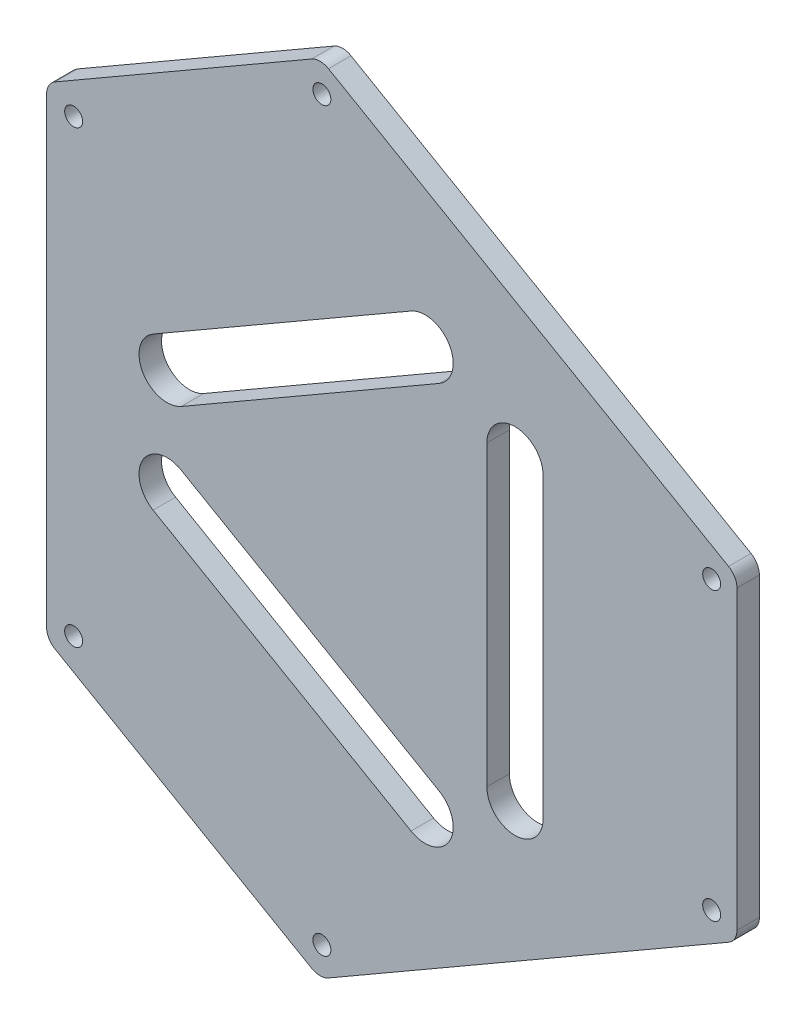
ISO-10303-21;
HEADER;
FILE_DESCRIPTION(('STEP AP214'),'2;1');
FILE_NAME('part.step','',(''),(''),'','','');
FILE_SCHEMA(('AUTOMOTIVE_DESIGN { 1 0 10303 214 1 1 1 1 }'));
ENDSEC;
DATA;
#1=APPLICATION_CONTEXT('core data for automotive mechanical design processes');
#2=APPLICATION_PROTOCOL_DEFINITION('international standard','automotive_design',2000,#1);
#3=PRODUCT_CONTEXT('',#1,'mechanical');
#4=PRODUCT('Part','Part','',(#3));
#5=PRODUCT_RELATED_PRODUCT_CATEGORY('part','',(#4));
#6=PRODUCT_DEFINITION_FORMATION('','',#4);
#7=PRODUCT_DEFINITION_CONTEXT('part definition',#1,'design');
#8=PRODUCT_DEFINITION('design','',#6,#7);
#9=PRODUCT_DEFINITION_SHAPE('','',#8);
#10=(LENGTH_UNIT() NAMED_UNIT(*) SI_UNIT(.MILLI.,.METRE.));
#11=(NAMED_UNIT(*) PLANE_ANGLE_UNIT() SI_UNIT($,.RADIAN.));
#12=(NAMED_UNIT(*) SI_UNIT($,.STERADIAN.) SOLID_ANGLE_UNIT());
#13=UNCERTAINTY_MEASURE_WITH_UNIT(LENGTH_MEASURE(1.E-05),#10,'distance_accuracy_value','');
#14=(GEOMETRIC_REPRESENTATION_CONTEXT(3) GLOBAL_UNCERTAINTY_ASSIGNED_CONTEXT((#13)) GLOBAL_UNIT_ASSIGNED_CONTEXT((#10,
#11,#12)) REPRESENTATION_CONTEXT('',''));
#15=CARTESIAN_POINT('',(0.,0.,0.));
#16=DIRECTION('',(0.,0.,1.));
#17=DIRECTION('',(1.,0.,0.));
#18=AXIS2_PLACEMENT_3D('',#15,#16,#17);
#19=CARTESIAN_POINT('',(25.9645003406306,-26.5,4.));
#20=DIRECTION('',(0.,0.,-1.));
#21=DIRECTION('',(-1.,0.,0.));
#22=AXIS2_PLACEMENT_3D('',#19,#20,#21);
#23=CYLINDRICAL_SURFACE('',#22,5.00000000000001);
#24=CARTESIAN_POINT('',(25.9645003406306,-26.5,0.));
#25=DIRECTION('',(0.,0.,1.));
#26=DIRECTION('',(1.,0.,0.));
#27=AXIS2_PLACEMENT_3D('',#24,#25,#26);
#28=CIRCLE('',#27,5.00000000000001);
#29=CARTESIAN_POINT('',(20.9645003406306,-26.5,0.));
#30=VERTEX_POINT('',#29);
#31=CARTESIAN_POINT('',(30.9645003406307,-26.5,0.));
#32=VERTEX_POINT('',#31);
#33=EDGE_CURVE('E316',#30,#32,#28,.T.);
#34=ORIENTED_EDGE('',*,*,#33,.F.);
#35=DIRECTION('',(0.,0.,-1.));
#36=VECTOR('',#35,1.);
#37=CARTESIAN_POINT('',(20.9645003406306,-26.5,4.));
#38=LINE('',#37,#36);
#39=CARTESIAN_POINT('',(20.9645003406306,-26.5,4.));
#40=VERTEX_POINT('',#39);
#41=EDGE_CURVE('E354',#40,#30,#38,.T.);
#42=ORIENTED_EDGE('',*,*,#41,.F.);
#43=CARTESIAN_POINT('',(25.9645003406306,-26.5,4.));
#44=DIRECTION('',(0.,0.,1.));
#45=DIRECTION('',(1.,0.,0.));
#46=AXIS2_PLACEMENT_3D('',#43,#44,#45);
#47=CIRCLE('',#46,5.00000000000001);
#48=CARTESIAN_POINT('',(30.9645003406307,-26.5,4.));
#49=VERTEX_POINT('',#48);
#50=EDGE_CURVE('E247',#40,#49,#47,.T.);
#51=ORIENTED_EDGE('',*,*,#50,.T.);
#52=DIRECTION('',(0.,0.,-1.));
#53=VECTOR('',#52,1.);
#54=CARTESIAN_POINT('',(30.9645003406307,-26.5,4.));
#55=LINE('',#54,#53);
#56=EDGE_CURVE('E347',#49,#32,#55,.T.);
#57=ORIENTED_EDGE('',*,*,#56,.T.);
#58=EDGE_LOOP('',(#34,#42,#51,#57));
#59=FACE_BOUND('',#58,.T.);
#60=ADVANCED_FACE('F41',(#59),#23,.F.);
#61=CARTESIAN_POINT('',(20.9645003406306,0.,4.));
#62=DIRECTION('',(1.,0.,0.));
#63=DIRECTION('',(0.,0.,-1.));
#64=AXIS2_PLACEMENT_3D('',#61,#62,#63);
#65=PLANE('',#64);
#66=DIRECTION('',(0.,-1.,0.));
#67=VECTOR('',#66,1.);
#68=CARTESIAN_POINT('',(20.9645003406306,0.,0.));
#69=LINE('',#68,#67);
#70=CARTESIAN_POINT('',(20.9645003406306,26.5,0.));
#71=VERTEX_POINT('',#70);
#72=EDGE_CURVE('E319',#71,#30,#69,.T.);
#73=ORIENTED_EDGE('',*,*,#72,.F.);
#74=DIRECTION('',(0.,0.,-1.));
#75=VECTOR('',#74,1.);
#76=CARTESIAN_POINT('',(20.9645003406306,26.5,4.));
#77=LINE('',#76,#75);
#78=CARTESIAN_POINT('',(20.9645003406306,26.5,4.));
#79=VERTEX_POINT('',#78);
#80=EDGE_CURVE('E352',#79,#71,#77,.T.);
#81=ORIENTED_EDGE('',*,*,#80,.F.);
#82=DIRECTION('',(0.,-1.,0.));
#83=VECTOR('',#82,1.);
#84=CARTESIAN_POINT('',(20.9645003406306,0.,4.));
#85=LINE('',#84,#83);
#86=EDGE_CURVE('E250',#79,#40,#85,.T.);
#87=ORIENTED_EDGE('',*,*,#86,.T.);
#88=ORIENTED_EDGE('',*,*,#41,.T.);
#89=EDGE_LOOP('',(#73,#81,#87,#88));
#90=FACE_BOUND('',#89,.T.);
#91=ADVANCED_FACE('F477',(#90),#65,.T.);
#92=CARTESIAN_POINT('',(25.9645003406306,26.5,4.));
#93=DIRECTION('',(0.,0.,-1.));
#94=DIRECTION('',(-1.,0.,0.));
#95=AXIS2_PLACEMENT_3D('',#92,#93,#94);
#96=CYLINDRICAL_SURFACE('',#95,5.00000000000001);
#97=CARTESIAN_POINT('',(25.9645003406306,26.5,0.));
#98=DIRECTION('',(0.,0.,1.));
#99=DIRECTION('',(1.,0.,0.));
#100=AXIS2_PLACEMENT_3D('',#97,#98,#99);
#101=CIRCLE('',#100,5.00000000000001);
#102=CARTESIAN_POINT('',(30.9645003406307,26.5,0.));
#103=VERTEX_POINT('',#102);
#104=EDGE_CURVE('E322',#103,#71,#101,.T.);
#105=ORIENTED_EDGE('',*,*,#104,.F.);
#106=DIRECTION('',(0.,0.,-1.));
#107=VECTOR('',#106,1.);
#108=CARTESIAN_POINT('',(30.9645003406307,26.5,4.));
#109=LINE('',#108,#107);
#110=CARTESIAN_POINT('',(30.9645003406307,26.5,4.));
#111=VERTEX_POINT('',#110);
#112=EDGE_CURVE('E349',#111,#103,#109,.T.);
#113=ORIENTED_EDGE('',*,*,#112,.F.);
#114=CARTESIAN_POINT('',(25.9645003406306,26.5,4.));
#115=DIRECTION('',(0.,0.,1.));
#116=DIRECTION('',(1.,0.,0.));
#117=AXIS2_PLACEMENT_3D('',#114,#115,#116);
#118=CIRCLE('',#117,5.00000000000001);
#119=EDGE_CURVE('E253',#111,#79,#118,.T.);
#120=ORIENTED_EDGE('',*,*,#119,.T.);
#121=ORIENTED_EDGE('',*,*,#80,.T.);
#122=EDGE_LOOP('',(#105,#113,#120,#121));
#123=FACE_BOUND('',#122,.T.);
#124=ADVANCED_FACE('F483',(#123),#96,.F.);
#125=CARTESIAN_POINT('',(-35.9319233705993,-9.23591689155713,4.));
#126=DIRECTION('',(0.,0.,-1.));
#127=DIRECTION('',(-1.,0.,0.));
#128=AXIS2_PLACEMENT_3D('',#125,#126,#127);
#129=CYLINDRICAL_SURFACE('',#128,5.);
#130=CARTESIAN_POINT('',(-35.9319233705993,-9.23591689155713,0.));
#131=DIRECTION('',(0.,0.,1.));
#132=DIRECTION('',(1.,0.,0.));
#133=AXIS2_PLACEMENT_3D('',#130,#131,#132);
#134=CIRCLE('',#133,5.);
#135=CARTESIAN_POINT('',(-33.4319233705993,-4.90578987263493,0.));
#136=VERTEX_POINT('',#135);
#137=CARTESIAN_POINT('',(-38.4319233705993,-13.5660439104793,0.));
#138=VERTEX_POINT('',#137);
#139=EDGE_CURVE('E304',#136,#138,#134,.T.);
#140=ORIENTED_EDGE('',*,*,#139,.F.);
#141=DIRECTION('',(0.,0.,-1.));
#142=VECTOR('',#141,1.);
#143=CARTESIAN_POINT('',(-33.4319233705993,-4.90578987263493,4.));
#144=LINE('',#143,#142);
#145=CARTESIAN_POINT('',(-33.4319233705993,-4.90578987263493,4.));
#146=VERTEX_POINT('',#145);
#147=EDGE_CURVE('E350',#146,#136,#144,.T.);
#148=ORIENTED_EDGE('',*,*,#147,.F.);
#149=CARTESIAN_POINT('',(-35.9319233705993,-9.23591689155713,4.));
#150=DIRECTION('',(0.,0.,1.));
#151=DIRECTION('',(1.,0.,0.));
#152=AXIS2_PLACEMENT_3D('',#149,#150,#151);
#153=CIRCLE('',#152,5.);
#154=CARTESIAN_POINT('',(-38.4319233705993,-13.5660439104793,4.));
#155=VERTEX_POINT('',#154);
#156=EDGE_CURVE('E236',#146,#155,#153,.T.);
#157=ORIENTED_EDGE('',*,*,#156,.T.);
#158=DIRECTION('',(0.,0.,-1.));
#159=VECTOR('',#158,1.);
#160=CARTESIAN_POINT('',(-38.4319233705993,-13.5660439104793,4.));
#161=LINE('',#160,#159);
#162=EDGE_CURVE('E214',#155,#138,#161,.T.);
#163=ORIENTED_EDGE('',*,*,#162,.T.);
#164=EDGE_LOOP('',(#140,#148,#157,#163));
#165=FACE_BOUND('',#164,.T.);
#166=ADVANCED_FACE('F502',(#165),#129,.F.);
#167=CARTESIAN_POINT('',(-10.4822501703149,-18.155789872633,4.));
#168=DIRECTION('',(-0.5,-0.866025403784439,0.));
#169=DIRECTION('',(0.866025403784439,-0.5,0.));
#170=AXIS2_PLACEMENT_3D('',#167,#168,#169);
#171=PLANE('',#170);
#172=DIRECTION('',(-0.866025403784439,0.5,0.));
#173=VECTOR('',#172,1.);
#174=CARTESIAN_POINT('',(-10.4822501703149,-18.155789872633,0.));
#175=LINE('',#174,#173);
#176=CARTESIAN_POINT('',(12.467423029976,-31.4057898726349,0.));
#177=VERTEX_POINT('',#176);
#178=EDGE_CURVE('E307',#177,#136,#175,.T.);
#179=ORIENTED_EDGE('',*,*,#178,.F.);
#180=DIRECTION('',(0.,0.,-1.));
#181=VECTOR('',#180,1.);
#182=CARTESIAN_POINT('',(12.467423029976,-31.4057898726349,4.));
#183=LINE('',#182,#181);
#184=CARTESIAN_POINT('',(12.467423029976,-31.4057898726349,4.));
#185=VERTEX_POINT('',#184);
#186=EDGE_CURVE('E360',#185,#177,#183,.T.);
#187=ORIENTED_EDGE('',*,*,#186,.F.);
#188=DIRECTION('',(-0.866025403784439,0.5,0.));
#189=VECTOR('',#188,1.);
#190=CARTESIAN_POINT('',(-10.4822501703149,-18.155789872633,4.));
#191=LINE('',#190,#189);
#192=EDGE_CURVE('E239',#185,#146,#191,.T.);
#193=ORIENTED_EDGE('',*,*,#192,.T.);
#194=ORIENTED_EDGE('',*,*,#147,.T.);
#195=EDGE_LOOP('',(#179,#187,#193,#194));
#196=FACE_BOUND('',#195,.T.);
#197=ADVANCED_FACE('F498',(#196),#171,.T.);
#198=CARTESIAN_POINT('',(9.96742302997598,-35.7359168915571,4.));
#199=DIRECTION('',(0.,0.,-1.));
#200=DIRECTION('',(-1.,0.,0.));
#201=AXIS2_PLACEMENT_3D('',#198,#199,#200);
#202=CYLINDRICAL_SURFACE('',#201,5.);
#203=CARTESIAN_POINT('',(9.96742302997598,-35.7359168915571,0.));
#204=DIRECTION('',(0.,0.,1.));
#205=DIRECTION('',(1.,0.,0.));
#206=AXIS2_PLACEMENT_3D('',#203,#204,#205);
#207=CIRCLE('',#206,5.);
#208=CARTESIAN_POINT('',(7.46742302997598,-40.0660439104793,0.));
#209=VERTEX_POINT('',#208);
#210=EDGE_CURVE('E310',#209,#177,#207,.T.);
#211=ORIENTED_EDGE('',*,*,#210,.F.);
#212=DIRECTION('',(0.,0.,-1.));
#213=VECTOR('',#212,1.);
#214=CARTESIAN_POINT('',(7.46742302997598,-40.0660439104793,4.));
#215=LINE('',#214,#213);
#216=CARTESIAN_POINT('',(7.46742302997598,-40.0660439104793,4.));
#217=VERTEX_POINT('',#216);
#218=EDGE_CURVE('E358',#217,#209,#215,.T.);
#219=ORIENTED_EDGE('',*,*,#218,.F.);
#220=CARTESIAN_POINT('',(9.96742302997598,-35.7359168915571,4.));
#221=DIRECTION('',(0.,0.,1.));
#222=DIRECTION('',(1.,0.,0.));
#223=AXIS2_PLACEMENT_3D('',#220,#221,#222);
#224=CIRCLE('',#223,5.);
#225=EDGE_CURVE('E242',#217,#185,#224,.T.);
#226=ORIENTED_EDGE('',*,*,#225,.T.);
#227=ORIENTED_EDGE('',*,*,#186,.T.);
#228=EDGE_LOOP('',(#211,#219,#226,#227));
#229=FACE_BOUND('',#228,.T.);
#230=ADVANCED_FACE('F495',(#229),#202,.F.);
#231=CARTESIAN_POINT('',(9.96742302997304,35.7359168915521,4.));
#232=DIRECTION('',(0.,0.,-1.));
#233=DIRECTION('',(-1.,0.,0.));
#234=AXIS2_PLACEMENT_3D('',#231,#232,#233);
#235=CYLINDRICAL_SURFACE('',#234,5.);
#236=CARTESIAN_POINT('',(9.96742302997304,35.7359168915521,0.));
#237=DIRECTION('',(0.,0.,1.));
#238=DIRECTION('',(1.,0.,0.));
#239=AXIS2_PLACEMENT_3D('',#236,#237,#238);
#240=CIRCLE('',#239,5.);
#241=CARTESIAN_POINT('',(12.467423029973,31.4057898726298,0.));
#242=VERTEX_POINT('',#241);
#243=CARTESIAN_POINT('',(7.46742302997305,40.0660439104742,0.));
#244=VERTEX_POINT('',#243);
#245=EDGE_CURVE('E209',#242,#244,#240,.T.);
#246=ORIENTED_EDGE('',*,*,#245,.F.);
#247=DIRECTION('',(0.,0.,-1.));
#248=VECTOR('',#247,1.);
#249=CARTESIAN_POINT('',(12.467423029973,31.4057898726298,4.));
#250=LINE('',#249,#248);
#251=CARTESIAN_POINT('',(12.467423029973,31.4057898726298,4.));
#252=VERTEX_POINT('',#251);
#253=EDGE_CURVE('E204',#252,#242,#250,.T.);
#254=ORIENTED_EDGE('',*,*,#253,.F.);
#255=CARTESIAN_POINT('',(9.96742302997304,35.7359168915521,4.));
#256=DIRECTION('',(0.,0.,1.));
#257=DIRECTION('',(1.,0.,0.));
#258=AXIS2_PLACEMENT_3D('',#255,#256,#257);
#259=CIRCLE('',#258,5.);
#260=CARTESIAN_POINT('',(7.46742302997305,40.0660439104742,4.));
#261=VERTEX_POINT('',#260);
#262=EDGE_CURVE('E207',#252,#261,#259,.T.);
#263=ORIENTED_EDGE('',*,*,#262,.T.);
#264=DIRECTION('',(0.,0.,-1.));
#265=VECTOR('',#264,1.);
#266=CARTESIAN_POINT('',(7.46742302997305,40.0660439104742,4.));
#267=LINE('',#266,#265);
#268=EDGE_CURVE('E276',#261,#244,#267,.T.);
#269=ORIENTED_EDGE('',*,*,#268,.T.);
#270=EDGE_LOOP('',(#246,#254,#263,#269));
#271=FACE_BOUND('',#270,.T.);
#272=ADVANCED_FACE('F206',(#271),#235,.F.);
#273=CARTESIAN_POINT('',(-10.4822501703135,18.1557898726305,4.));
#274=DIRECTION('',(-0.5,0.866025403784439,0.));
#275=DIRECTION('',(-0.866025403784439,-0.5,0.));
#276=AXIS2_PLACEMENT_3D('',#273,#274,#275);
#277=PLANE('',#276);
#278=DIRECTION('',(0.866025403784439,0.5,0.));
#279=VECTOR('',#278,1.);
#280=CARTESIAN_POINT('',(-10.4822501703135,18.1557898726305,0.));
#281=LINE('',#280,#279);
#282=CARTESIAN_POINT('',(-33.4319233706022,4.90578987262986,0.));
#283=VERTEX_POINT('',#282);
#284=EDGE_CURVE('E296',#283,#242,#281,.T.);
#285=ORIENTED_EDGE('',*,*,#284,.F.);
#286=DIRECTION('',(0.,0.,-1.));
#287=VECTOR('',#286,1.);
#288=CARTESIAN_POINT('',(-33.4319233706022,4.90578987262986,4.));
#289=LINE('',#288,#287);
#290=CARTESIAN_POINT('',(-33.4319233706022,4.90578987262986,4.));
#291=VERTEX_POINT('',#290);
#292=EDGE_CURVE('E215',#291,#283,#289,.T.);
#293=ORIENTED_EDGE('',*,*,#292,.F.);
#294=DIRECTION('',(0.866025403784439,0.5,0.));
#295=VECTOR('',#294,1.);
#296=CARTESIAN_POINT('',(-10.4822501703135,18.1557898726305,4.));
#297=LINE('',#296,#295);
#298=EDGE_CURVE('E222',#291,#252,#297,.T.);
#299=ORIENTED_EDGE('',*,*,#298,.T.);
#300=ORIENTED_EDGE('',*,*,#253,.T.);
#301=EDGE_LOOP('',(#285,#293,#299,#300));
#302=FACE_BOUND('',#301,.T.);
#303=ADVANCED_FACE('F229',(#302),#277,.T.);
#304=CARTESIAN_POINT('',(-35.9319233706022,9.23591689155207,4.));
#305=DIRECTION('',(0.,0.,-1.));
#306=DIRECTION('',(-1.,0.,0.));
#307=AXIS2_PLACEMENT_3D('',#304,#305,#306);
#308=CYLINDRICAL_SURFACE('',#307,5.);
#309=CARTESIAN_POINT('',(-35.9319233706022,9.23591689155207,0.));
#310=DIRECTION('',(0.,0.,1.));
#311=DIRECTION('',(1.,0.,0.));
#312=AXIS2_PLACEMENT_3D('',#309,#310,#311);
#313=CIRCLE('',#312,5.);
#314=CARTESIAN_POINT('',(-38.4319233706022,13.5660439104743,0.));
#315=VERTEX_POINT('',#314);
#316=EDGE_CURVE('E298',#315,#283,#313,.T.);
#317=ORIENTED_EDGE('',*,*,#316,.F.);
#318=DIRECTION('',(0.,0.,-1.));
#319=VECTOR('',#318,1.);
#320=CARTESIAN_POINT('',(-38.4319233706022,13.5660439104743,4.));
#321=LINE('',#320,#319);
#322=CARTESIAN_POINT('',(-38.4319233706022,13.5660439104743,4.));
#323=VERTEX_POINT('',#322);
#324=EDGE_CURVE('E364',#323,#315,#321,.T.);
#325=ORIENTED_EDGE('',*,*,#324,.F.);
#326=CARTESIAN_POINT('',(-35.9319233706022,9.23591689155207,4.));
#327=DIRECTION('',(0.,0.,1.));
#328=DIRECTION('',(1.,0.,0.));
#329=AXIS2_PLACEMENT_3D('',#326,#327,#328);
#330=CIRCLE('',#329,5.);
#331=EDGE_CURVE('E230',#323,#291,#330,.T.);
#332=ORIENTED_EDGE('',*,*,#331,.T.);
#333=ORIENTED_EDGE('',*,*,#292,.T.);
#334=EDGE_LOOP('',(#317,#325,#332,#333));
#335=FACE_BOUND('',#334,.T.);
#336=ADVANCED_FACE('F511',(#335),#308,.F.);
#337=CARTESIAN_POINT('',(-57.3859190048907,0.,4.));
#338=DIRECTION('',(1.,0.,0.));
#339=DIRECTION('',(0.,1.,0.));
#340=AXIS2_PLACEMENT_3D('',#337,#338,#339);
#341=PLANE('',#340);
#342=DIRECTION('',(0.,-1.,0.));
#343=VECTOR('',#342,1.);
#344=CARTESIAN_POINT('',(-57.3859190048907,0.,4.));
#345=LINE('',#344,#343);
#346=CARTESIAN_POINT('',(-57.3859190048907,41.097595660273,4.));
#347=VERTEX_POINT('',#346);
#348=CARTESIAN_POINT('',(-57.3859190048906,-41.097595660273,4.));
#349=VERTEX_POINT('',#348);
#350=EDGE_CURVE('E346',#347,#349,#345,.T.);
#351=ORIENTED_EDGE('',*,*,#350,.F.);
#352=DIRECTION('',(0.,0.,-1.));
#353=VECTOR('',#352,1.);
#354=CARTESIAN_POINT('',(-57.3859190048907,41.097595660273,0.));
#355=LINE('',#354,#353);
#356=CARTESIAN_POINT('',(-57.3859190048907,41.097595660273,0.));
#357=VERTEX_POINT('',#356);
#358=EDGE_CURVE('E405',#347,#357,#355,.T.);
#359=ORIENTED_EDGE('',*,*,#358,.T.);
#360=DIRECTION('',(0.,-1.,0.));
#361=VECTOR('',#360,1.);
#362=CARTESIAN_POINT('',(-57.3859190048907,0.,0.));
#363=LINE('',#362,#361);
#364=CARTESIAN_POINT('',(-57.3859190048906,-41.097595660273,0.));
#365=VERTEX_POINT('',#364);
#366=EDGE_CURVE('E277',#357,#365,#363,.T.);
#367=ORIENTED_EDGE('',*,*,#366,.T.);
#368=DIRECTION('',(0.,0.,-1.));
#369=VECTOR('',#368,1.);
#370=CARTESIAN_POINT('',(-57.3859190048906,-41.097595660273,4.));
#371=LINE('',#370,#369);
#372=EDGE_CURVE('E403',#365,#349,#371,.F.);
#373=ORIENTED_EDGE('',*,*,#372,.T.);
#374=EDGE_LOOP('',(#351,#359,#367,#373));
#375=FACE_BOUND('',#374,.T.);
#376=ADVANCED_FACE('F514',(#375),#341,.F.);
#377=CARTESIAN_POINT('',(-32.8922606893514,-56.9710666897571,4.));
#378=DIRECTION('',(-0.5,-0.866025403784439,0.));
#379=DIRECTION('',(0.866025403784439,-0.5,0.));
#380=AXIS2_PLACEMENT_3D('',#377,#378,#379);
#381=PLANE('',#380);
#382=DIRECTION('',(-0.866025403784439,0.5,0.));
#383=VECTOR('',#382,1.);
#384=CARTESIAN_POINT('',(-32.8922606893514,-56.9710666897571,4.));
#385=LINE('',#384,#383);
#386=CARTESIAN_POINT('',(-10.2186234118843,-70.0616972754107,4.));
#387=VERTEX_POINT('',#386);
#388=CARTESIAN_POINT('',(-55.8859190048906,-43.6956718716263,4.));
#389=VERTEX_POINT('',#388);
#390=EDGE_CURVE('E427',#387,#389,#385,.T.);
#391=ORIENTED_EDGE('',*,*,#390,.T.);
#392=DIRECTION('',(0.,0.,-1.));
#393=VECTOR('',#392,1.);
#394=CARTESIAN_POINT('',(-55.8859190048906,-43.6956718716263,0.));
#395=LINE('',#394,#393);
#396=CARTESIAN_POINT('',(-55.8859190048906,-43.6956718716263,0.));
#397=VERTEX_POINT('',#396);
#398=EDGE_CURVE('E410',#389,#397,#395,.T.);
#399=ORIENTED_EDGE('',*,*,#398,.T.);
#400=DIRECTION('',(-0.866025403784439,0.5,0.));
#401=VECTOR('',#400,1.);
#402=CARTESIAN_POINT('',(-32.8922606893514,-56.9710666897571,0.));
#403=LINE('',#402,#401);
#404=CARTESIAN_POINT('',(-10.2186234118843,-70.0616972754107,0.));
#405=VERTEX_POINT('',#404);
#406=EDGE_CURVE('E280',#405,#397,#403,.T.);
#407=ORIENTED_EDGE('',*,*,#406,.F.);
#408=DIRECTION('',(0.,0.,-1.));
#409=VECTOR('',#408,1.);
#410=CARTESIAN_POINT('',(-10.2186234118843,-70.0616972754107,4.));
#411=LINE('',#410,#409);
#412=EDGE_CURVE('E408',#405,#387,#411,.F.);
#413=ORIENTED_EDGE('',*,*,#412,.T.);
#414=EDGE_LOOP('',(#391,#399,#407,#413));
#415=FACE_BOUND('',#414,.T.);
#416=ADVANCED_FACE('F464',(#415),#381,.T.);
#417=CARTESIAN_POINT('',(28.5329489834093,-49.4205173290356,4.));
#418=DIRECTION('',(0.5,-0.866025403784439,0.));
#419=DIRECTION('',(0.866025403784439,0.5,0.));
#420=AXIS2_PLACEMENT_3D('',#417,#418,#419);
#421=PLANE('',#420);
#422=DIRECTION('',(-0.866025403784439,-0.5,0.));
#423=VECTOR('',#422,1.);
#424=CARTESIAN_POINT('',(28.5329489834093,-49.4205173290356,4.));
#425=LINE('',#424,#423);
#426=CARTESIAN_POINT('',(63.9645003406307,-28.9641016151378,4.));
#427=VERTEX_POINT('',#426);
#428=CARTESIAN_POINT('',(-7.21862341188426,-70.0616972754107,4.));
#429=VERTEX_POINT('',#428);
#430=EDGE_CURVE('E418',#427,#429,#425,.T.);
#431=ORIENTED_EDGE('',*,*,#430,.T.);
#432=DIRECTION('',(0.,0.,-1.));
#433=VECTOR('',#432,1.);
#434=CARTESIAN_POINT('',(-7.21862341188426,-70.0616972754107,4.));
#435=LINE('',#434,#433);
#436=CARTESIAN_POINT('',(-7.21862341188426,-70.0616972754107,0.));
#437=VERTEX_POINT('',#436);
#438=EDGE_CURVE('E11',#429,#437,#435,.T.);
#439=ORIENTED_EDGE('',*,*,#438,.T.);
#440=DIRECTION('',(-0.866025403784439,-0.5,0.));
#441=VECTOR('',#440,1.);
#442=CARTESIAN_POINT('',(28.5329489834093,-49.4205173290356,0.));
#443=LINE('',#442,#441);
#444=CARTESIAN_POINT('',(63.9645003406307,-28.9641016151378,0.));
#445=VERTEX_POINT('',#444);
#446=EDGE_CURVE('E283',#445,#437,#443,.T.);
#447=ORIENTED_EDGE('',*,*,#446,.F.);
#448=DIRECTION('',(0.,0.,-1.));
#449=VECTOR('',#448,1.);
#450=CARTESIAN_POINT('',(63.9645003406307,-28.9641016151378,4.));
#451=LINE('',#450,#449);
#452=EDGE_CURVE('E49',#445,#427,#451,.F.);
#453=ORIENTED_EDGE('',*,*,#452,.T.);
#454=EDGE_LOOP('',(#431,#439,#447,#453));
#455=FACE_BOUND('',#454,.T.);
#456=ADVANCED_FACE('F417',(#455),#421,.T.);
#457=CARTESIAN_POINT('',(65.4645003406307,0.,4.));
#458=DIRECTION('',(1.,0.,0.));
#459=DIRECTION('',(0.,0.,-1.));
#460=AXIS2_PLACEMENT_3D('',#457,#458,#459);
#461=PLANE('',#460);
#462=DIRECTION('',(0.,-1.,0.));
#463=VECTOR('',#462,1.);
#464=CARTESIAN_POINT('',(65.4645003406307,0.,0.));
#465=LINE('',#464,#463);
#466=CARTESIAN_POINT('',(65.4645003406307,26.3660254037845,0.));
#467=VERTEX_POINT('',#466);
#468=CARTESIAN_POINT('',(65.4645003406307,-26.3660254037844,0.));
#469=VERTEX_POINT('',#468);
#470=EDGE_CURVE('E286',#467,#469,#465,.T.);
#471=ORIENTED_EDGE('',*,*,#470,.F.);
#472=DIRECTION('',(0.,0.,-1.));
#473=VECTOR('',#472,1.);
#474=CARTESIAN_POINT('',(65.4645003406307,26.3660254037845,4.));
#475=LINE('',#474,#473);
#476=CARTESIAN_POINT('',(65.4645003406307,26.3660254037845,4.));
#477=VERTEX_POINT('',#476);
#478=EDGE_CURVE('E386',#467,#477,#475,.F.);
#479=ORIENTED_EDGE('',*,*,#478,.T.);
#480=DIRECTION('',(0.,-1.,0.));
#481=VECTOR('',#480,1.);
#482=CARTESIAN_POINT('',(65.4645003406307,0.,4.));
#483=LINE('',#482,#481);
#484=CARTESIAN_POINT('',(65.4645003406307,-26.3660254037844,4.));
#485=VERTEX_POINT('',#484);
#486=EDGE_CURVE('E426',#477,#485,#483,.T.);
#487=ORIENTED_EDGE('',*,*,#486,.T.);
#488=DIRECTION('',(0.,0.,-1.));
#489=VECTOR('',#488,1.);
#490=CARTESIAN_POINT('',(65.4645003406307,-26.3660254037844,4.));
#491=LINE('',#490,#489);
#492=EDGE_CURVE('E383',#485,#469,#491,.T.);
#493=ORIENTED_EDGE('',*,*,#492,.T.);
#494=EDGE_LOOP('',(#471,#479,#487,#493));
#495=FACE_BOUND('',#494,.T.);
#496=ADVANCED_FACE('F432',(#495),#461,.T.);
#497=CARTESIAN_POINT('',(28.5329489834093,49.4205173290356,4.));
#498=DIRECTION('',(-0.5,-0.866025403784439,0.));
#499=DIRECTION('',(0.866025403784439,-0.5,0.));
#500=AXIS2_PLACEMENT_3D('',#497,#498,#499);
#501=PLANE('',#500);
#502=DIRECTION('',(-0.866025403784439,0.5,0.));
#503=VECTOR('',#502,1.);
#504=CARTESIAN_POINT('',(28.5329489834093,49.4205173290356,4.));
#505=LINE('',#504,#503);
#506=CARTESIAN_POINT('',(63.9645003406307,28.9641016151378,4.));
#507=VERTEX_POINT('',#506);
#508=CARTESIAN_POINT('',(-7.21862341188426,70.0616972754107,4.));
#509=VERTEX_POINT('',#508);
#510=EDGE_CURVE('E446',#507,#509,#505,.T.);
#511=ORIENTED_EDGE('',*,*,#510,.F.);
#512=DIRECTION('',(0.,0.,-1.));
#513=VECTOR('',#512,1.);
#514=CARTESIAN_POINT('',(63.9645003406307,28.9641016151378,0.));
#515=LINE('',#514,#513);
#516=CARTESIAN_POINT('',(63.9645003406307,28.9641016151378,0.));
#517=VERTEX_POINT('',#516);
#518=EDGE_CURVE('E368',#507,#517,#515,.T.);
#519=ORIENTED_EDGE('',*,*,#518,.T.);
#520=DIRECTION('',(-0.866025403784439,0.5,0.));
#521=VECTOR('',#520,1.);
#522=CARTESIAN_POINT('',(28.5329489834093,49.4205173290356,0.));
#523=LINE('',#522,#521);
#524=CARTESIAN_POINT('',(-7.21862341188426,70.0616972754107,0.));
#525=VERTEX_POINT('',#524);
#526=EDGE_CURVE('E289',#517,#525,#523,.T.);
#527=ORIENTED_EDGE('',*,*,#526,.T.);
#528=DIRECTION('',(0.,0.,-1.));
#529=VECTOR('',#528,1.);
#530=CARTESIAN_POINT('',(-7.21862341188426,70.0616972754107,4.));
#531=LINE('',#530,#529);
#532=EDGE_CURVE('E356',#525,#509,#531,.F.);
#533=ORIENTED_EDGE('',*,*,#532,.T.);
#534=EDGE_LOOP('',(#511,#519,#527,#533));
#535=FACE_BOUND('',#534,.T.);
#536=ADVANCED_FACE('F444',(#535),#501,.F.);
#537=CARTESIAN_POINT('',(-52.5658979668187,-40.046806024011,4.));
#538=DIRECTION('',(0.,0.,-1.));
#539=DIRECTION('',(-1.,0.,0.));
#540=AXIS2_PLACEMENT_3D('',#537,#538,#539);
#541=CYLINDRICAL_SURFACE('',#540,1.6);
#542=CARTESIAN_POINT('',(-52.5658979668187,-40.046806024011,4.));
#543=DIRECTION('',(0.,0.,1.));
#544=DIRECTION('',(1.,0.,0.));
#545=AXIS2_PLACEMENT_3D('',#542,#543,#544);
#546=CIRCLE('',#545,1.6);
#547=CARTESIAN_POINT('',(-50.9658979668187,-40.046806024011,4.));
#548=VERTEX_POINT('',#547);
#549=EDGE_CURVE('E270',#548,#548,#546,.F.);
#550=ORIENTED_EDGE('',*,*,#549,.F.);
#551=EDGE_LOOP('',(#550));
#552=FACE_BOUND('',#551,.T.);
#553=CARTESIAN_POINT('',(-52.5658979668187,-40.046806024011,0.));
#554=DIRECTION('',(0.,0.,1.));
#555=DIRECTION('',(1.,0.,0.));
#556=AXIS2_PLACEMENT_3D('',#553,#554,#555);
#557=CIRCLE('',#556,1.6);
#558=CARTESIAN_POINT('',(-50.9658979668187,-40.046806024011,0.));
#559=VERTEX_POINT('',#558);
#560=EDGE_CURVE('E340',#559,#559,#557,.F.);
#561=ORIENTED_EDGE('',*,*,#560,.T.);
#562=EDGE_LOOP('',(#561));
#563=FACE_BOUND('',#562,.T.);
#564=ADVANCED_FACE('F525',(#552,#563),#541,.F.);
#565=CARTESIAN_POINT('',(-8.39860237381246,-65.5468060240112,4.));
#566=DIRECTION('',(0.,0.,-1.));
#567=DIRECTION('',(-1.,0.,0.));
#568=AXIS2_PLACEMENT_3D('',#565,#566,#567);
#569=CYLINDRICAL_SURFACE('',#568,1.60000000000001);
#570=CARTESIAN_POINT('',(-8.39860237381246,-65.5468060240112,4.));
#571=DIRECTION('',(0.,0.,1.));
#572=DIRECTION('',(1.,0.,0.));
#573=AXIS2_PLACEMENT_3D('',#570,#571,#572);
#574=CIRCLE('',#573,1.60000000000001);
#575=CARTESIAN_POINT('',(-6.79860237381245,-65.5468060240112,4.));
#576=VERTEX_POINT('',#575);
#577=EDGE_CURVE('E267',#576,#576,#574,.T.);
#578=ORIENTED_EDGE('',*,*,#577,.T.);
#579=EDGE_LOOP('',(#578));
#580=FACE_BOUND('',#579,.T.);
#581=CARTESIAN_POINT('',(-8.39860237381246,-65.5468060240112,0.));
#582=DIRECTION('',(0.,0.,1.));
#583=DIRECTION('',(1.,0.,0.));
#584=AXIS2_PLACEMENT_3D('',#581,#582,#583);
#585=CIRCLE('',#584,1.60000000000001);
#586=CARTESIAN_POINT('',(-6.79860237381245,-65.5468060240112,0.));
#587=VERTEX_POINT('',#586);
#588=EDGE_CURVE('E337',#587,#587,#585,.T.);
#589=ORIENTED_EDGE('',*,*,#588,.F.);
#590=EDGE_LOOP('',(#589));
#591=FACE_BOUND('',#590,.T.);
#592=ADVANCED_FACE('F694',(#580,#591),#569,.F.);
#593=CARTESIAN_POINT('',(60.9645003406307,-25.5,4.));
#594=DIRECTION('',(0.,0.,-1.));
#595=DIRECTION('',(-1.,0.,0.));
#596=AXIS2_PLACEMENT_3D('',#593,#594,#595);
#597=CYLINDRICAL_SURFACE('',#596,1.6);
#598=CARTESIAN_POINT('',(60.9645003406307,-25.5,4.));
#599=DIRECTION('',(0.,0.,1.));
#600=DIRECTION('',(1.,0.,0.));
#601=AXIS2_PLACEMENT_3D('',#598,#599,#600);
#602=CIRCLE('',#601,1.6);
#603=CARTESIAN_POINT('',(62.5645003406307,-25.5,4.));
#604=VERTEX_POINT('',#603);
#605=EDGE_CURVE('E264',#604,#604,#602,.F.);
#606=ORIENTED_EDGE('',*,*,#605,.F.);
#607=EDGE_LOOP('',(#606));
#608=FACE_BOUND('',#607,.T.);
#609=CARTESIAN_POINT('',(60.9645003406307,-25.5,0.));
#610=DIRECTION('',(0.,0.,1.));
#611=DIRECTION('',(1.,0.,0.));
#612=AXIS2_PLACEMENT_3D('',#609,#610,#611);
#613=CIRCLE('',#612,1.6);
#614=CARTESIAN_POINT('',(62.5645003406307,-25.5,0.));
#615=VERTEX_POINT('',#614);
#616=EDGE_CURVE('E334',#615,#615,#613,.F.);
#617=ORIENTED_EDGE('',*,*,#616,.T.);
#618=EDGE_LOOP('',(#617));
#619=FACE_BOUND('',#618,.T.);
#620=ADVANCED_FACE('F684',(#608,#619),#597,.F.);
#621=CARTESIAN_POINT('',(60.9645003406307,25.5,4.));
#622=DIRECTION('',(0.,0.,-1.));
#623=DIRECTION('',(-1.,0.,0.));
#624=AXIS2_PLACEMENT_3D('',#621,#622,#623);
#625=CYLINDRICAL_SURFACE('',#624,1.6);
#626=CARTESIAN_POINT('',(60.9645003406307,25.5,4.));
#627=DIRECTION('',(0.,0.,1.));
#628=DIRECTION('',(1.,0.,0.));
#629=AXIS2_PLACEMENT_3D('',#626,#627,#628);
#630=CIRCLE('',#629,1.6);
#631=CARTESIAN_POINT('',(62.5645003406307,25.5,4.));
#632=VERTEX_POINT('',#631);
#633=EDGE_CURVE('E261',#632,#632,#630,.T.);
#634=ORIENTED_EDGE('',*,*,#633,.T.);
#635=EDGE_LOOP('',(#634));
#636=FACE_BOUND('',#635,.T.);
#637=CARTESIAN_POINT('',(60.9645003406307,25.5,0.));
#638=DIRECTION('',(0.,0.,1.));
#639=DIRECTION('',(1.,0.,0.));
#640=AXIS2_PLACEMENT_3D('',#637,#638,#639);
#641=CIRCLE('',#640,1.6);
#642=CARTESIAN_POINT('',(62.5645003406307,25.5,0.));
#643=VERTEX_POINT('',#642);
#644=EDGE_CURVE('E331',#643,#643,#641,.T.);
#645=ORIENTED_EDGE('',*,*,#644,.F.);
#646=EDGE_LOOP('',(#645));
#647=FACE_BOUND('',#646,.T.);
#648=ADVANCED_FACE('F674',(#636,#647),#625,.F.);
#649=CARTESIAN_POINT('',(-8.39860237381153,65.5468060240113,4.));
#650=DIRECTION('',(0.,0.,-1.));
#651=DIRECTION('',(-1.,0.,0.));
#652=AXIS2_PLACEMENT_3D('',#649,#650,#651);
#653=CYLINDRICAL_SURFACE('',#652,1.60000000000002);
#654=CARTESIAN_POINT('',(-8.39860237381153,65.5468060240113,4.));
#655=DIRECTION('',(0.,0.,1.));
#656=DIRECTION('',(1.,0.,0.));
#657=AXIS2_PLACEMENT_3D('',#654,#655,#656);
#658=CIRCLE('',#657,1.60000000000002);
#659=CARTESIAN_POINT('',(-6.79860237381151,65.5468060240113,4.));
#660=VERTEX_POINT('',#659);
#661=EDGE_CURVE('E258',#660,#660,#658,.F.);
#662=ORIENTED_EDGE('',*,*,#661,.F.);
#663=EDGE_LOOP('',(#662));
#664=FACE_BOUND('',#663,.T.);
#665=CARTESIAN_POINT('',(-8.39860237381153,65.5468060240113,0.));
#666=DIRECTION('',(0.,0.,1.));
#667=DIRECTION('',(1.,0.,0.));
#668=AXIS2_PLACEMENT_3D('',#665,#666,#667);
#669=CIRCLE('',#668,1.60000000000002);
#670=CARTESIAN_POINT('',(-6.79860237381151,65.5468060240113,0.));
#671=VERTEX_POINT('',#670);
#672=EDGE_CURVE('E328',#671,#671,#669,.F.);
#673=ORIENTED_EDGE('',*,*,#672,.T.);
#674=EDGE_LOOP('',(#673));
#675=FACE_BOUND('',#674,.T.);
#676=ADVANCED_FACE('F664',(#664,#675),#653,.F.);
#677=CARTESIAN_POINT('',(30.9645003406307,0.,4.));
#678=DIRECTION('',(1.,0.,0.));
#679=DIRECTION('',(0.,0.,-1.));
#680=AXIS2_PLACEMENT_3D('',#677,#678,#679);
#681=PLANE('',#680);
#682=DIRECTION('',(0.,-1.,0.));
#683=VECTOR('',#682,1.);
#684=CARTESIAN_POINT('',(30.9645003406307,0.,0.));
#685=LINE('',#684,#683);
#686=EDGE_CURVE('E325',#103,#32,#685,.T.);
#687=ORIENTED_EDGE('',*,*,#686,.T.);
#688=ORIENTED_EDGE('',*,*,#56,.F.);
#689=DIRECTION('',(0.,-1.,0.));
#690=VECTOR('',#689,1.);
#691=CARTESIAN_POINT('',(30.9645003406307,0.,4.));
#692=LINE('',#691,#690);
#693=EDGE_CURVE('E256',#111,#49,#692,.T.);
#694=ORIENTED_EDGE('',*,*,#693,.F.);
#695=ORIENTED_EDGE('',*,*,#112,.T.);
#696=EDGE_LOOP('',(#687,#688,#694,#695));
#697=FACE_BOUND('',#696,.T.);
#698=ADVANCED_FACE('F493',(#697),#681,.F.);
#699=CARTESIAN_POINT('',(-15.4822501703149,-26.8160439104774,4.));
#700=DIRECTION('',(-0.5,-0.866025403784439,0.));
#701=DIRECTION('',(0.866025403784439,-0.5,0.));
#702=AXIS2_PLACEMENT_3D('',#699,#700,#701);
#703=PLANE('',#702);
#704=DIRECTION('',(-0.866025403784439,0.5,0.));
#705=VECTOR('',#704,1.);
#706=CARTESIAN_POINT('',(-15.4822501703149,-26.8160439104774,0.));
#707=LINE('',#706,#705);
#708=EDGE_CURVE('E313',#209,#138,#707,.T.);
#709=ORIENTED_EDGE('',*,*,#708,.T.);
#710=ORIENTED_EDGE('',*,*,#162,.F.);
#711=DIRECTION('',(-0.866025403784439,0.5,0.));
#712=VECTOR('',#711,1.);
#713=CARTESIAN_POINT('',(-15.4822501703149,-26.8160439104774,4.));
#714=LINE('',#713,#712);
#715=EDGE_CURVE('E245',#217,#155,#714,.T.);
#716=ORIENTED_EDGE('',*,*,#715,.F.);
#717=ORIENTED_EDGE('',*,*,#218,.T.);
#718=EDGE_LOOP('',(#709,#710,#716,#717));
#719=FACE_BOUND('',#718,.T.);
#720=ADVANCED_FACE('F489',(#719),#703,.F.);
#721=CARTESIAN_POINT('',(-15.4822501703135,26.8160439104749,4.));
#722=DIRECTION('',(-0.5,0.866025403784439,0.));
#723=DIRECTION('',(-0.866025403784439,-0.5,0.));
#724=AXIS2_PLACEMENT_3D('',#721,#722,#723);
#725=PLANE('',#724);
#726=DIRECTION('',(0.866025403784439,0.5,0.));
#727=VECTOR('',#726,1.);
#728=CARTESIAN_POINT('',(-15.4822501703135,26.8160439104749,0.));
#729=LINE('',#728,#727);
#730=EDGE_CURVE('E301',#315,#244,#729,.T.);
#731=ORIENTED_EDGE('',*,*,#730,.T.);
#732=ORIENTED_EDGE('',*,*,#268,.F.);
#733=DIRECTION('',(0.866025403784439,0.5,0.));
#734=VECTOR('',#733,1.);
#735=CARTESIAN_POINT('',(-15.4822501703135,26.8160439104749,4.));
#736=LINE('',#735,#734);
#737=EDGE_CURVE('E225',#323,#261,#736,.T.);
#738=ORIENTED_EDGE('',*,*,#737,.F.);
#739=ORIENTED_EDGE('',*,*,#324,.T.);
#740=EDGE_LOOP('',(#731,#732,#738,#739));
#741=FACE_BOUND('',#740,.T.);
#742=ADVANCED_FACE('F492',(#741),#725,.F.);
#743=CARTESIAN_POINT('',(-32.8922606893514,56.9710666897571,4.));
#744=DIRECTION('',(-0.5,0.866025403784439,0.));
#745=DIRECTION('',(-0.866025403784439,-0.5,0.));
#746=AXIS2_PLACEMENT_3D('',#743,#744,#745);
#747=PLANE('',#746);
#748=DIRECTION('',(0.866025403784439,0.5,0.));
#749=VECTOR('',#748,1.);
#750=CARTESIAN_POINT('',(-32.8922606893514,56.9710666897571,4.));
#751=LINE('',#750,#749);
#752=CARTESIAN_POINT('',(-55.8859190048907,43.6956718716263,4.));
#753=VERTEX_POINT('',#752);
#754=CARTESIAN_POINT('',(-10.2186234118843,70.0616972754107,4.));
#755=VERTEX_POINT('',#754);
#756=EDGE_CURVE('E227',#753,#755,#751,.T.);
#757=ORIENTED_EDGE('',*,*,#756,.T.);
#758=DIRECTION('',(0.,0.,-1.));
#759=VECTOR('',#758,1.);
#760=CARTESIAN_POINT('',(-10.2186234118843,70.0616972754107,0.));
#761=LINE('',#760,#759);
#762=CARTESIAN_POINT('',(-10.2186234118843,70.0616972754107,0.));
#763=VERTEX_POINT('',#762);
#764=EDGE_CURVE('E400',#755,#763,#761,.T.);
#765=ORIENTED_EDGE('',*,*,#764,.T.);
#766=DIRECTION('',(0.866025403784439,0.5,0.));
#767=VECTOR('',#766,1.);
#768=CARTESIAN_POINT('',(-32.8922606893514,56.9710666897571,0.));
#769=LINE('',#768,#767);
#770=CARTESIAN_POINT('',(-55.8859190048907,43.6956718716263,0.));
#771=VERTEX_POINT('',#770);
#772=EDGE_CURVE('E292',#771,#763,#769,.T.);
#773=ORIENTED_EDGE('',*,*,#772,.F.);
#774=DIRECTION('',(0.,0.,-1.));
#775=VECTOR('',#774,1.);
#776=CARTESIAN_POINT('',(-55.8859190048907,43.6956718716263,4.));
#777=LINE('',#776,#775);
#778=EDGE_CURVE('E63',#771,#753,#777,.F.);
#779=ORIENTED_EDGE('',*,*,#778,.T.);
#780=EDGE_LOOP('',(#757,#765,#773,#779));
#781=FACE_BOUND('',#780,.T.);
#782=ADVANCED_FACE('F509',(#781),#747,.T.);
#783=CARTESIAN_POINT('',(-52.5658979668181,40.0468060240117,4.));
#784=DIRECTION('',(0.,0.,-1.));
#785=DIRECTION('',(-1.,0.,0.));
#786=AXIS2_PLACEMENT_3D('',#783,#784,#785);
#787=CYLINDRICAL_SURFACE('',#786,1.6);
#788=CARTESIAN_POINT('',(-52.5658979668181,40.0468060240117,4.));
#789=DIRECTION('',(0.,0.,1.));
#790=DIRECTION('',(1.,0.,0.));
#791=AXIS2_PLACEMENT_3D('',#788,#789,#790);
#792=CIRCLE('',#791,1.6);
#793=CARTESIAN_POINT('',(-50.9658979668181,40.0468060240117,4.));
#794=VERTEX_POINT('',#793);
#795=EDGE_CURVE('E273',#794,#794,#792,.T.);
#796=ORIENTED_EDGE('',*,*,#795,.T.);
#797=EDGE_LOOP('',(#796));
#798=FACE_BOUND('',#797,.T.);
#799=CARTESIAN_POINT('',(-52.5658979668181,40.0468060240117,0.));
#800=DIRECTION('',(0.,0.,1.));
#801=DIRECTION('',(1.,0.,0.));
#802=AXIS2_PLACEMENT_3D('',#799,#800,#801);
#803=CIRCLE('',#802,1.6);
#804=CARTESIAN_POINT('',(-50.9658979668181,40.0468060240117,0.));
#805=VERTEX_POINT('',#804);
#806=EDGE_CURVE('E343',#805,#805,#803,.T.);
#807=ORIENTED_EDGE('',*,*,#806,.F.);
#808=EDGE_LOOP('',(#807));
#809=FACE_BOUND('',#808,.T.);
#810=ADVANCED_FACE('F522',(#798,#809),#787,.F.);
#811=CARTESIAN_POINT('',(0.,0.,4.));
#812=DIRECTION('',(0.,0.,1.));
#813=DIRECTION('',(1.,0.,0.));
#814=AXIS2_PLACEMENT_3D('',#811,#812,#813);
#815=PLANE('',#814);
#816=ORIENTED_EDGE('',*,*,#486,.F.);
#817=CARTESIAN_POINT('',(62.4645003406307,26.3660254037845,4.));
#818=DIRECTION('',(0.,0.,1.));
#819=DIRECTION('',(1.,0.,0.));
#820=AXIS2_PLACEMENT_3D('',#817,#818,#819);
#821=CIRCLE('',#820,3.);
#822=EDGE_CURVE('E397',#477,#507,#821,.T.);
#823=ORIENTED_EDGE('',*,*,#822,.T.);
#824=ORIENTED_EDGE('',*,*,#510,.T.);
#825=CARTESIAN_POINT('',(-8.71862341188427,67.4636210640574,4.));
#826=DIRECTION('',(0.,0.,1.));
#827=DIRECTION('',(1.,0.,0.));
#828=AXIS2_PLACEMENT_3D('',#825,#826,#827);
#829=CIRCLE('',#828,3.);
#830=EDGE_CURVE('E56',#509,#755,#829,.T.);
#831=ORIENTED_EDGE('',*,*,#830,.T.);
#832=ORIENTED_EDGE('',*,*,#756,.F.);
#833=CARTESIAN_POINT('',(-54.3859190048907,41.097595660273,4.));
#834=DIRECTION('',(0.,0.,1.));
#835=DIRECTION('',(1.,0.,0.));
#836=AXIS2_PLACEMENT_3D('',#833,#834,#835);
#837=CIRCLE('',#836,3.);
#838=EDGE_CURVE('E394',#753,#347,#837,.T.);
#839=ORIENTED_EDGE('',*,*,#838,.T.);
#840=ORIENTED_EDGE('',*,*,#350,.T.);
#841=CARTESIAN_POINT('',(-54.3859190048906,-41.097595660273,4.));
#842=DIRECTION('',(0.,0.,1.));
#843=DIRECTION('',(1.,0.,0.));
#844=AXIS2_PLACEMENT_3D('',#841,#842,#843);
#845=CIRCLE('',#844,3.);
#846=EDGE_CURVE('E392',#349,#389,#845,.T.);
#847=ORIENTED_EDGE('',*,*,#846,.T.);
#848=ORIENTED_EDGE('',*,*,#390,.F.);
#849=CARTESIAN_POINT('',(-8.71862341188426,-67.4636210640574,4.));
#850=DIRECTION('',(0.,0.,1.));
#851=DIRECTION('',(1.,0.,0.));
#852=AXIS2_PLACEMENT_3D('',#849,#850,#851);
#853=CIRCLE('',#852,3.);
#854=EDGE_CURVE('E390',#387,#429,#853,.T.);
#855=ORIENTED_EDGE('',*,*,#854,.T.);
#856=ORIENTED_EDGE('',*,*,#430,.F.);
#857=CARTESIAN_POINT('',(62.4645003406307,-26.3660254037844,4.));
#858=DIRECTION('',(0.,0.,1.));
#859=DIRECTION('',(1.,0.,0.));
#860=AXIS2_PLACEMENT_3D('',#857,#858,#859);
#861=CIRCLE('',#860,3.);
#862=EDGE_CURVE('E388',#427,#485,#861,.T.);
#863=ORIENTED_EDGE('',*,*,#862,.T.);
#864=EDGE_LOOP('',(#816,#823,#824,#831,#832,#839,#840,#847,#848,#855,#856,#863));
#865=FACE_BOUND('',#864,.T.);
#866=ORIENTED_EDGE('',*,*,#262,.F.);
#867=ORIENTED_EDGE('',*,*,#298,.F.);
#868=ORIENTED_EDGE('',*,*,#331,.F.);
#869=ORIENTED_EDGE('',*,*,#737,.T.);
#870=EDGE_LOOP('',(#866,#867,#868,#869));
#871=FACE_BOUND('',#870,.T.);
#872=ORIENTED_EDGE('',*,*,#156,.F.);
#873=ORIENTED_EDGE('',*,*,#192,.F.);
#874=ORIENTED_EDGE('',*,*,#225,.F.);
#875=ORIENTED_EDGE('',*,*,#715,.T.);
#876=EDGE_LOOP('',(#872,#873,#874,#875));
#877=FACE_BOUND('',#876,.T.);
#878=ORIENTED_EDGE('',*,*,#50,.F.);
#879=ORIENTED_EDGE('',*,*,#86,.F.);
#880=ORIENTED_EDGE('',*,*,#119,.F.);
#881=ORIENTED_EDGE('',*,*,#693,.T.);
#882=EDGE_LOOP('',(#878,#879,#880,#881));
#883=FACE_BOUND('',#882,.T.);
#884=ORIENTED_EDGE('',*,*,#661,.T.);
#885=EDGE_LOOP('',(#884));
#886=FACE_BOUND('',#885,.T.);
#887=ORIENTED_EDGE('',*,*,#633,.F.);
#888=EDGE_LOOP('',(#887));
#889=FACE_BOUND('',#888,.T.);
#890=ORIENTED_EDGE('',*,*,#605,.T.);
#891=EDGE_LOOP('',(#890));
#892=FACE_BOUND('',#891,.T.);
#893=ORIENTED_EDGE('',*,*,#577,.F.);
#894=EDGE_LOOP('',(#893));
#895=FACE_BOUND('',#894,.T.);
#896=ORIENTED_EDGE('',*,*,#549,.T.);
#897=EDGE_LOOP('',(#896));
#898=FACE_BOUND('',#897,.T.);
#899=ORIENTED_EDGE('',*,*,#795,.F.);
#900=EDGE_LOOP('',(#899));
#901=FACE_BOUND('',#900,.T.);
#902=ADVANCED_FACE('F219',(#865,#871,#877,#883,#886,#889,#892,#895,#898,#901),#815,.T.);
#903=CARTESIAN_POINT('',(0.,0.,0.));
#904=DIRECTION('',(0.,0.,1.));
#905=DIRECTION('',(1.,0.,0.));
#906=AXIS2_PLACEMENT_3D('',#903,#904,#905);
#907=PLANE('',#906);
#908=ORIENTED_EDGE('',*,*,#526,.F.);
#909=CARTESIAN_POINT('',(62.4645003406307,26.3660254037845,0.));
#910=DIRECTION('',(0.,0.,1.));
#911=DIRECTION('',(1.,0.,0.));
#912=AXIS2_PLACEMENT_3D('',#909,#910,#911);
#913=CIRCLE('',#912,3.);
#914=EDGE_CURVE('E381',#517,#467,#913,.F.);
#915=ORIENTED_EDGE('',*,*,#914,.T.);
#916=ORIENTED_EDGE('',*,*,#470,.T.);
#917=CARTESIAN_POINT('',(62.4645003406307,-26.3660254037844,0.));
#918=DIRECTION('',(0.,0.,1.));
#919=DIRECTION('',(1.,0.,0.));
#920=AXIS2_PLACEMENT_3D('',#917,#918,#919);
#921=CIRCLE('',#920,3.);
#922=EDGE_CURVE('E371',#469,#445,#921,.F.);
#923=ORIENTED_EDGE('',*,*,#922,.T.);
#924=ORIENTED_EDGE('',*,*,#446,.T.);
#925=CARTESIAN_POINT('',(-8.71862341188426,-67.4636210640574,0.));
#926=DIRECTION('',(0.,0.,1.));
#927=DIRECTION('',(1.,0.,0.));
#928=AXIS2_PLACEMENT_3D('',#925,#926,#927);
#929=CIRCLE('',#928,3.);
#930=EDGE_CURVE('E373',#437,#405,#929,.F.);
#931=ORIENTED_EDGE('',*,*,#930,.T.);
#932=ORIENTED_EDGE('',*,*,#406,.T.);
#933=CARTESIAN_POINT('',(-54.3859190048906,-41.097595660273,0.));
#934=DIRECTION('',(0.,0.,1.));
#935=DIRECTION('',(1.,0.,0.));
#936=AXIS2_PLACEMENT_3D('',#933,#934,#935);
#937=CIRCLE('',#936,3.);
#938=EDGE_CURVE('E375',#397,#365,#937,.F.);
#939=ORIENTED_EDGE('',*,*,#938,.T.);
#940=ORIENTED_EDGE('',*,*,#366,.F.);
#941=CARTESIAN_POINT('',(-54.3859190048907,41.097595660273,0.));
#942=DIRECTION('',(0.,0.,1.));
#943=DIRECTION('',(1.,0.,0.));
#944=AXIS2_PLACEMENT_3D('',#941,#942,#943);
#945=CIRCLE('',#944,3.);
#946=EDGE_CURVE('E377',#357,#771,#945,.F.);
#947=ORIENTED_EDGE('',*,*,#946,.T.);
#948=ORIENTED_EDGE('',*,*,#772,.T.);
#949=CARTESIAN_POINT('',(-8.71862341188427,67.4636210640574,0.));
#950=DIRECTION('',(0.,0.,1.));
#951=DIRECTION('',(1.,0.,0.));
#952=AXIS2_PLACEMENT_3D('',#949,#950,#951);
#953=CIRCLE('',#952,3.);
#954=EDGE_CURVE('E379',#763,#525,#953,.F.);
#955=ORIENTED_EDGE('',*,*,#954,.T.);
#956=EDGE_LOOP('',(#908,#915,#916,#923,#924,#931,#932,#939,#940,#947,#948,#955));
#957=FACE_BOUND('',#956,.T.);
#958=ORIENTED_EDGE('',*,*,#245,.T.);
#959=ORIENTED_EDGE('',*,*,#730,.F.);
#960=ORIENTED_EDGE('',*,*,#316,.T.);
#961=ORIENTED_EDGE('',*,*,#284,.T.);
#962=EDGE_LOOP('',(#958,#959,#960,#961));
#963=FACE_BOUND('',#962,.T.);
#964=ORIENTED_EDGE('',*,*,#139,.T.);
#965=ORIENTED_EDGE('',*,*,#708,.F.);
#966=ORIENTED_EDGE('',*,*,#210,.T.);
#967=ORIENTED_EDGE('',*,*,#178,.T.);
#968=EDGE_LOOP('',(#964,#965,#966,#967));
#969=FACE_BOUND('',#968,.T.);
#970=ORIENTED_EDGE('',*,*,#33,.T.);
#971=ORIENTED_EDGE('',*,*,#686,.F.);
#972=ORIENTED_EDGE('',*,*,#104,.T.);
#973=ORIENTED_EDGE('',*,*,#72,.T.);
#974=EDGE_LOOP('',(#970,#971,#972,#973));
#975=FACE_BOUND('',#974,.T.);
#976=ORIENTED_EDGE('',*,*,#672,.F.);
#977=EDGE_LOOP('',(#976));
#978=FACE_BOUND('',#977,.T.);
#979=ORIENTED_EDGE('',*,*,#644,.T.);
#980=EDGE_LOOP('',(#979));
#981=FACE_BOUND('',#980,.T.);
#982=ORIENTED_EDGE('',*,*,#616,.F.);
#983=EDGE_LOOP('',(#982));
#984=FACE_BOUND('',#983,.T.);
#985=ORIENTED_EDGE('',*,*,#588,.T.);
#986=EDGE_LOOP('',(#985));
#987=FACE_BOUND('',#986,.T.);
#988=ORIENTED_EDGE('',*,*,#560,.F.);
#989=EDGE_LOOP('',(#988));
#990=FACE_BOUND('',#989,.T.);
#991=ORIENTED_EDGE('',*,*,#806,.T.);
#992=EDGE_LOOP('',(#991));
#993=FACE_BOUND('',#992,.T.);
#994=ADVANCED_FACE('F436',(#957,#963,#969,#975,#978,#981,#984,#987,#990,#993),#907,.F.);
#995=CARTESIAN_POINT('',(62.4645003406307,26.3660254037845,4.));
#996=DIRECTION('',(0.,0.,1.));
#997=DIRECTION('',(1.,0.,0.));
#998=AXIS2_PLACEMENT_3D('',#995,#996,#997);
#999=CYLINDRICAL_SURFACE('',#998,3.);
#1000=ORIENTED_EDGE('',*,*,#822,.F.);
#1001=ORIENTED_EDGE('',*,*,#478,.F.);
#1002=ORIENTED_EDGE('',*,*,#914,.F.);
#1003=ORIENTED_EDGE('',*,*,#518,.F.);
#1004=EDGE_LOOP('',(#1000,#1001,#1002,#1003));
#1005=FACE_BOUND('',#1004,.T.);
#1006=ADVANCED_FACE('F441',(#1005),#999,.T.);
#1007=CARTESIAN_POINT('',(-8.71862341188427,67.4636210640574,4.));
#1008=DIRECTION('',(0.,0.,1.));
#1009=DIRECTION('',(1.,0.,0.));
#1010=AXIS2_PLACEMENT_3D('',#1007,#1008,#1009);
#1011=CYLINDRICAL_SURFACE('',#1010,3.);
#1012=ORIENTED_EDGE('',*,*,#830,.F.);
#1013=ORIENTED_EDGE('',*,*,#532,.F.);
#1014=ORIENTED_EDGE('',*,*,#954,.F.);
#1015=ORIENTED_EDGE('',*,*,#764,.F.);
#1016=EDGE_LOOP('',(#1012,#1013,#1014,#1015));
#1017=FACE_BOUND('',#1016,.T.);
#1018=ADVANCED_FACE('F536',(#1017),#1011,.T.);
#1019=CARTESIAN_POINT('',(-54.3859190048907,41.097595660273,4.));
#1020=DIRECTION('',(0.,0.,1.));
#1021=DIRECTION('',(1.,0.,0.));
#1022=AXIS2_PLACEMENT_3D('',#1019,#1020,#1021);
#1023=CYLINDRICAL_SURFACE('',#1022,3.);
#1024=ORIENTED_EDGE('',*,*,#838,.F.);
#1025=ORIENTED_EDGE('',*,*,#778,.F.);
#1026=ORIENTED_EDGE('',*,*,#946,.F.);
#1027=ORIENTED_EDGE('',*,*,#358,.F.);
#1028=EDGE_LOOP('',(#1024,#1025,#1026,#1027));
#1029=FACE_BOUND('',#1028,.T.);
#1030=ADVANCED_FACE('F474',(#1029),#1023,.T.);
#1031=CARTESIAN_POINT('',(-54.3859190048906,-41.097595660273,4.));
#1032=DIRECTION('',(0.,0.,1.));
#1033=DIRECTION('',(1.,0.,0.));
#1034=AXIS2_PLACEMENT_3D('',#1031,#1032,#1033);
#1035=CYLINDRICAL_SURFACE('',#1034,3.);
#1036=ORIENTED_EDGE('',*,*,#846,.F.);
#1037=ORIENTED_EDGE('',*,*,#372,.F.);
#1038=ORIENTED_EDGE('',*,*,#938,.F.);
#1039=ORIENTED_EDGE('',*,*,#398,.F.);
#1040=EDGE_LOOP('',(#1036,#1037,#1038,#1039));
#1041=FACE_BOUND('',#1040,.T.);
#1042=ADVANCED_FACE('F461',(#1041),#1035,.T.);
#1043=CARTESIAN_POINT('',(-8.71862341188426,-67.4636210640574,4.));
#1044=DIRECTION('',(0.,0.,-1.));
#1045=DIRECTION('',(-1.,0.,0.));
#1046=AXIS2_PLACEMENT_3D('',#1043,#1044,#1045);
#1047=CYLINDRICAL_SURFACE('',#1046,3.);
#1048=ORIENTED_EDGE('',*,*,#854,.F.);
#1049=ORIENTED_EDGE('',*,*,#412,.F.);
#1050=ORIENTED_EDGE('',*,*,#930,.F.);
#1051=ORIENTED_EDGE('',*,*,#438,.F.);
#1052=EDGE_LOOP('',(#1048,#1049,#1050,#1051));
#1053=FACE_BOUND('',#1052,.T.);
#1054=ADVANCED_FACE('F468',(#1053),#1047,.T.);
#1055=CARTESIAN_POINT('',(62.4645003406307,-26.3660254037844,4.));
#1056=DIRECTION('',(0.,0.,-1.));
#1057=DIRECTION('',(-1.,0.,0.));
#1058=AXIS2_PLACEMENT_3D('',#1055,#1056,#1057);
#1059=CYLINDRICAL_SURFACE('',#1058,3.);
#1060=ORIENTED_EDGE('',*,*,#862,.F.);
#1061=ORIENTED_EDGE('',*,*,#452,.F.);
#1062=ORIENTED_EDGE('',*,*,#922,.F.);
#1063=ORIENTED_EDGE('',*,*,#492,.F.);
#1064=EDGE_LOOP('',(#1060,#1061,#1062,#1063));
#1065=FACE_BOUND('',#1064,.T.);
#1066=ADVANCED_FACE('F43',(#1065),#1059,.T.);
#1067=CLOSED_SHELL('',(#60,#91,#124,#166,#197,#230,#272,#303,#336,#376,#416,#456,#496,#536,#564,
#592,#620,#648,#676,#698,#720,#742,#782,#810,#902,#994,#1006,#1018,#1030,#1042,#1054,#1066));
#1068=MANIFOLD_SOLID_BREP('B2',#1067);
#1069=ADVANCED_BREP_SHAPE_REPRESENTATION('',(#18,#1068),#14);
#1070=SHAPE_DEFINITION_REPRESENTATION(#9,#1069);
ENDSEC;
END-ISO-10303-21;
